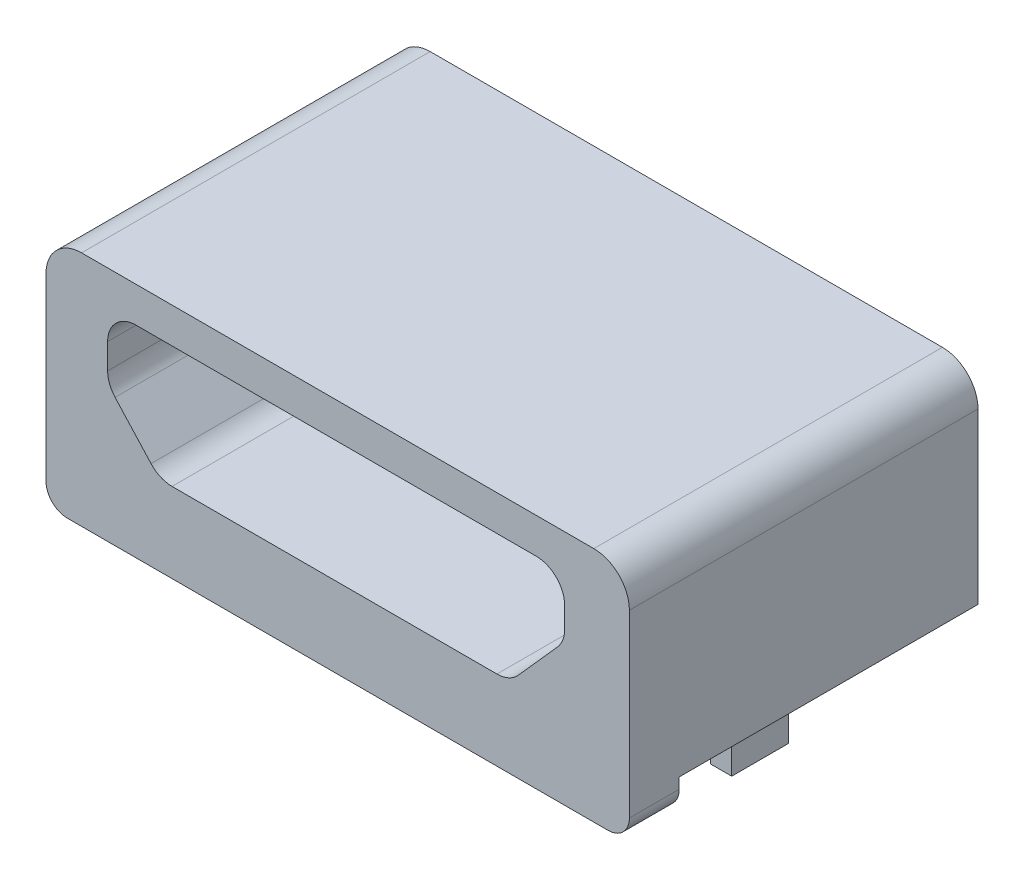
ISO-10303-21;
HEADER;
FILE_DESCRIPTION(('STEP AP214'),'2;1');
FILE_NAME('part.step','',(''),(''),'','','');
FILE_SCHEMA(('AUTOMOTIVE_DESIGN { 1 0 10303 214 1 1 1 1 }'));
ENDSEC;
DATA;
#1=APPLICATION_CONTEXT('core data for automotive mechanical design processes');
#2=APPLICATION_PROTOCOL_DEFINITION('international standard','automotive_design',2000,#1);
#3=PRODUCT_CONTEXT('',#1,'mechanical');
#4=PRODUCT('Part','Part','',(#3));
#5=PRODUCT_RELATED_PRODUCT_CATEGORY('part','',(#4));
#6=PRODUCT_DEFINITION_FORMATION('','',#4);
#7=PRODUCT_DEFINITION_CONTEXT('part definition',#1,'design');
#8=PRODUCT_DEFINITION('design','',#6,#7);
#9=PRODUCT_DEFINITION_SHAPE('','',#8);
#10=(LENGTH_UNIT() NAMED_UNIT(*) SI_UNIT(.MILLI.,.METRE.));
#11=(NAMED_UNIT(*) PLANE_ANGLE_UNIT() SI_UNIT($,.RADIAN.));
#12=(NAMED_UNIT(*) SI_UNIT($,.STERADIAN.) SOLID_ANGLE_UNIT());
#13=UNCERTAINTY_MEASURE_WITH_UNIT(LENGTH_MEASURE(1.E-05),#10,'distance_accuracy_value','');
#14=(GEOMETRIC_REPRESENTATION_CONTEXT(3) GLOBAL_UNCERTAINTY_ASSIGNED_CONTEXT((#13)) GLOBAL_UNIT_ASSIGNED_CONTEXT((#10,
#11,#12)) REPRESENTATION_CONTEXT('',''));
#15=CARTESIAN_POINT('',(0.,0.,0.));
#16=DIRECTION('',(0.,0.,1.));
#17=DIRECTION('',(1.,0.,0.));
#18=AXIS2_PLACEMENT_3D('',#15,#16,#17);
#19=CARTESIAN_POINT('',(0.,0.,4.2));
#20=DIRECTION('',(0.,1.,0.));
#21=DIRECTION('',(0.,0.,1.));
#22=AXIS2_PLACEMENT_3D('',#19,#20,#21);
#23=PLANE('',#22);
#24=DIRECTION('',(0.,0.,-1.));
#25=VECTOR('',#24,1.);
#26=CARTESIAN_POINT('',(0.34,0.,3.122));
#27=LINE('',#26,#25);
#28=CARTESIAN_POINT('',(0.34,0.,3.122));
#29=VERTEX_POINT('',#28);
#30=CARTESIAN_POINT('',(0.34,0.,2.322));
#31=VERTEX_POINT('',#30);
#32=EDGE_CURVE('E249',#29,#31,#27,.T.);
#33=ORIENTED_EDGE('',*,*,#32,.F.);
#34=DIRECTION('',(-1.,0.,0.));
#35=VECTOR('',#34,1.);
#36=CARTESIAN_POINT('',(0.34,0.,3.122));
#37=LINE('',#36,#35);
#38=CARTESIAN_POINT('',(0.64,0.,3.122));
#39=VERTEX_POINT('',#38);
#40=EDGE_CURVE('E262',#39,#29,#37,.T.);
#41=ORIENTED_EDGE('',*,*,#40,.F.);
#42=DIRECTION('',(0.,0.,1.));
#43=VECTOR('',#42,1.);
#44=CARTESIAN_POINT('',(0.64,0.,3.122));
#45=LINE('',#44,#43);
#46=CARTESIAN_POINT('',(0.64,0.,2.322));
#47=VERTEX_POINT('',#46);
#48=EDGE_CURVE('E271',#47,#39,#45,.T.);
#49=ORIENTED_EDGE('',*,*,#48,.F.);
#50=DIRECTION('',(1.,0.,0.));
#51=VECTOR('',#50,1.);
#52=CARTESIAN_POINT('',(0.34,0.,2.322));
#53=LINE('',#52,#51);
#54=EDGE_CURVE('E252',#31,#47,#53,.T.);
#55=ORIENTED_EDGE('',*,*,#54,.F.);
#56=EDGE_LOOP('',(#33,#41,#49,#55));
#57=FACE_BOUND('',#56,.T.);
#58=DIRECTION('',(1.,0.,0.));
#59=VECTOR('',#58,1.);
#60=CARTESIAN_POINT('',(0.,0.,0.));
#61=LINE('',#60,#59);
#62=CARTESIAN_POINT('',(0.,0.,0.));
#63=VERTEX_POINT('',#62);
#64=CARTESIAN_POINT('',(8.2,0.,0.));
#65=VERTEX_POINT('',#64);
#66=EDGE_CURVE('E489',#63,#65,#61,.T.);
#67=ORIENTED_EDGE('',*,*,#66,.T.);
#68=DIRECTION('',(0.,0.,-1.));
#69=VECTOR('',#68,1.);
#70=CARTESIAN_POINT('',(8.2,0.,4.2));
#71=LINE('',#70,#69);
#72=CARTESIAN_POINT('',(8.2,0.,4.2));
#73=VERTEX_POINT('',#72);
#74=EDGE_CURVE('E413',#73,#65,#71,.T.);
#75=ORIENTED_EDGE('',*,*,#74,.F.);
#76=DIRECTION('',(1.,0.,0.));
#77=VECTOR('',#76,1.);
#78=CARTESIAN_POINT('',(0.,0.,4.2));
#79=LINE('',#78,#77);
#80=CARTESIAN_POINT('',(0.,0.,4.2));
#81=VERTEX_POINT('',#80);
#82=EDGE_CURVE('E409',#81,#73,#79,.T.);
#83=ORIENTED_EDGE('',*,*,#82,.F.);
#84=DIRECTION('',(0.,0.,-1.));
#85=VECTOR('',#84,1.);
#86=CARTESIAN_POINT('',(0.,0.,4.2));
#87=LINE('',#86,#85);
#88=EDGE_CURVE('E417',#81,#63,#87,.T.);
#89=ORIENTED_EDGE('',*,*,#88,.T.);
#90=EDGE_LOOP('',(#67,#75,#83,#89));
#91=FACE_BOUND('',#90,.T.);
#92=DIRECTION('',(0.,0.,1.));
#93=VECTOR('',#92,1.);
#94=CARTESIAN_POINT('',(7.860000038,0.,2.322));
#95=LINE('',#94,#93);
#96=CARTESIAN_POINT('',(7.860000038,0.,2.322));
#97=VERTEX_POINT('',#96);
#98=CARTESIAN_POINT('',(7.860000038,0.,3.122));
#99=VERTEX_POINT('',#98);
#100=EDGE_CURVE('E248',#97,#99,#95,.T.);
#101=ORIENTED_EDGE('',*,*,#100,.F.);
#102=DIRECTION('',(1.,0.,0.));
#103=VECTOR('',#102,1.);
#104=CARTESIAN_POINT('',(7.860000038,0.,2.322));
#105=LINE('',#104,#103);
#106=CARTESIAN_POINT('',(7.560000038,0.,2.322));
#107=VERTEX_POINT('',#106);
#108=EDGE_CURVE('E245',#107,#97,#105,.T.);
#109=ORIENTED_EDGE('',*,*,#108,.F.);
#110=DIRECTION('',(0.,0.,-1.));
#111=VECTOR('',#110,1.);
#112=CARTESIAN_POINT('',(7.560000038,0.,2.322));
#113=LINE('',#112,#111);
#114=CARTESIAN_POINT('',(7.560000038,0.,3.122));
#115=VERTEX_POINT('',#114);
#116=EDGE_CURVE('E52',#115,#107,#113,.T.);
#117=ORIENTED_EDGE('',*,*,#116,.F.);
#118=DIRECTION('',(-1.,0.,0.));
#119=VECTOR('',#118,1.);
#120=CARTESIAN_POINT('',(7.860000038,0.,3.122));
#121=LINE('',#120,#119);
#122=EDGE_CURVE('E47',#99,#115,#121,.T.);
#123=ORIENTED_EDGE('',*,*,#122,.F.);
#124=EDGE_LOOP('',(#101,#109,#117,#123));
#125=FACE_BOUND('',#124,.T.);
#126=ADVANCED_FACE('F32',(#57,#91,#125),#23,.F.);
#127=CARTESIAN_POINT('',(0.,0.,4.2));
#128=DIRECTION('',(1.,0.,0.));
#129=DIRECTION('',(0.,0.,-1.));
#130=AXIS2_PLACEMENT_3D('',#127,#128,#129);
#131=PLANE('',#130);
#132=DIRECTION('',(0.,-1.,0.));
#133=VECTOR('',#132,1.);
#134=CARTESIAN_POINT('',(0.,2.88,4.2));
#135=LINE('',#134,#133);
#136=CARTESIAN_POINT('',(0.,-0.15,4.2));
#137=VERTEX_POINT('',#136);
#138=EDGE_CURVE('E361',#81,#137,#135,.T.);
#139=ORIENTED_EDGE('',*,*,#138,.T.);
#140=DIRECTION('',(0.,0.,-1.));
#141=VECTOR('',#140,1.);
#142=CARTESIAN_POINT('',(0.,-0.15,4.2));
#143=LINE('',#142,#141);
#144=CARTESIAN_POINT('',(0.,-0.15,4.9));
#145=VERTEX_POINT('',#144);
#146=EDGE_CURVE('E11',#137,#145,#143,.F.);
#147=ORIENTED_EDGE('',*,*,#146,.T.);
#148=DIRECTION('',(0.,-1.,0.));
#149=VECTOR('',#148,1.);
#150=CARTESIAN_POINT('',(0.,2.88,4.9));
#151=LINE('',#150,#149);
#152=CARTESIAN_POINT('',(0.,2.38,4.9));
#153=VERTEX_POINT('',#152);
#154=EDGE_CURVE('E384',#153,#145,#151,.T.);
#155=ORIENTED_EDGE('',*,*,#154,.F.);
#156=DIRECTION('',(0.,0.,-1.));
#157=VECTOR('',#156,1.);
#158=CARTESIAN_POINT('',(0.,2.38,4.2));
#159=LINE('',#158,#157);
#160=CARTESIAN_POINT('',(0.,2.38,0.));
#161=VERTEX_POINT('',#160);
#162=EDGE_CURVE('E438',#153,#161,#159,.T.);
#163=ORIENTED_EDGE('',*,*,#162,.T.);
#164=DIRECTION('',(0.,-1.,0.));
#165=VECTOR('',#164,1.);
#166=CARTESIAN_POINT('',(0.,0.,0.));
#167=LINE('',#166,#165);
#168=EDGE_CURVE('E396',#161,#63,#167,.T.);
#169=ORIENTED_EDGE('',*,*,#168,.T.);
#170=ORIENTED_EDGE('',*,*,#88,.F.);
#171=EDGE_LOOP('',(#139,#147,#155,#163,#169,#170));
#172=FACE_BOUND('',#171,.T.);
#173=ADVANCED_FACE('F483',(#172),#131,.F.);
#174=CARTESIAN_POINT('',(8.2,0.,4.2));
#175=DIRECTION('',(-1.,0.,0.));
#176=DIRECTION('',(0.,0.,1.));
#177=AXIS2_PLACEMENT_3D('',#174,#175,#176);
#178=PLANE('',#177);
#179=DIRECTION('',(0.,1.,0.));
#180=VECTOR('',#179,1.);
#181=CARTESIAN_POINT('',(8.2,2.88,4.9));
#182=LINE('',#181,#180);
#183=CARTESIAN_POINT('',(8.2,-0.15,4.9));
#184=VERTEX_POINT('',#183);
#185=CARTESIAN_POINT('',(8.2,2.38,4.9));
#186=VERTEX_POINT('',#185);
#187=EDGE_CURVE('E391',#184,#186,#182,.T.);
#188=ORIENTED_EDGE('',*,*,#187,.F.);
#189=DIRECTION('',(0.,0.,-1.));
#190=VECTOR('',#189,1.);
#191=CARTESIAN_POINT('',(8.2,-0.15,4.2));
#192=LINE('',#191,#190);
#193=CARTESIAN_POINT('',(8.2,-0.15,4.2));
#194=VERTEX_POINT('',#193);
#195=EDGE_CURVE('E441',#184,#194,#192,.T.);
#196=ORIENTED_EDGE('',*,*,#195,.T.);
#197=DIRECTION('',(0.,1.,0.));
#198=VECTOR('',#197,1.);
#199=CARTESIAN_POINT('',(8.2,2.88,4.2));
#200=LINE('',#199,#198);
#201=EDGE_CURVE('E388',#194,#73,#200,.T.);
#202=ORIENTED_EDGE('',*,*,#201,.T.);
#203=ORIENTED_EDGE('',*,*,#74,.T.);
#204=DIRECTION('',(0.,1.,0.));
#205=VECTOR('',#204,1.);
#206=CARTESIAN_POINT('',(8.2,0.,0.));
#207=LINE('',#206,#205);
#208=CARTESIAN_POINT('',(8.2,2.38,0.));
#209=VERTEX_POINT('',#208);
#210=EDGE_CURVE('E495',#65,#209,#207,.T.);
#211=ORIENTED_EDGE('',*,*,#210,.T.);
#212=DIRECTION('',(0.,0.,-1.));
#213=VECTOR('',#212,1.);
#214=CARTESIAN_POINT('',(8.2,2.38,4.2));
#215=LINE('',#214,#213);
#216=EDGE_CURVE('E431',#209,#186,#215,.F.);
#217=ORIENTED_EDGE('',*,*,#216,.T.);
#218=EDGE_LOOP('',(#188,#196,#202,#203,#211,#217));
#219=FACE_BOUND('',#218,.T.);
#220=ADVANCED_FACE('F464',(#219),#178,.F.);
#221=CARTESIAN_POINT('',(0.,2.88,4.2));
#222=DIRECTION('',(0.,-1.,0.));
#223=DIRECTION('',(1.,0.,0.));
#224=AXIS2_PLACEMENT_3D('',#221,#222,#223);
#225=PLANE('',#224);
#226=DIRECTION('',(-1.,0.,0.));
#227=VECTOR('',#226,1.);
#228=CARTESIAN_POINT('',(0.,2.88,4.9));
#229=LINE('',#228,#227);
#230=CARTESIAN_POINT('',(7.7,2.88,4.9));
#231=VERTEX_POINT('',#230);
#232=CARTESIAN_POINT('',(0.5,2.88,4.9));
#233=VERTEX_POINT('',#232);
#234=EDGE_CURVE('E393',#231,#233,#229,.T.);
#235=ORIENTED_EDGE('',*,*,#234,.F.);
#236=DIRECTION('',(0.,0.,-1.));
#237=VECTOR('',#236,1.);
#238=CARTESIAN_POINT('',(7.7,2.88,4.2));
#239=LINE('',#238,#237);
#240=CARTESIAN_POINT('',(7.7,2.88,0.));
#241=VERTEX_POINT('',#240);
#242=EDGE_CURVE('E424',#231,#241,#239,.T.);
#243=ORIENTED_EDGE('',*,*,#242,.T.);
#244=DIRECTION('',(-1.,0.,0.));
#245=VECTOR('',#244,1.);
#246=CARTESIAN_POINT('',(0.,2.88,0.));
#247=LINE('',#246,#245);
#248=CARTESIAN_POINT('',(0.5,2.88,0.));
#249=VERTEX_POINT('',#248);
#250=EDGE_CURVE('E414',#241,#249,#247,.T.);
#251=ORIENTED_EDGE('',*,*,#250,.T.);
#252=DIRECTION('',(0.,0.,-1.));
#253=VECTOR('',#252,1.);
#254=CARTESIAN_POINT('',(0.5,2.88,4.2));
#255=LINE('',#254,#253);
#256=EDGE_CURVE('E420',#249,#233,#255,.F.);
#257=ORIENTED_EDGE('',*,*,#256,.T.);
#258=EDGE_LOOP('',(#235,#243,#251,#257));
#259=FACE_BOUND('',#258,.T.);
#260=ADVANCED_FACE('F503',(#259),#225,.F.);
#261=CARTESIAN_POINT('',(0.,0.,0.));
#262=DIRECTION('',(0.,0.,-1.));
#263=DIRECTION('',(-1.,0.,0.));
#264=AXIS2_PLACEMENT_3D('',#261,#262,#263);
#265=PLANE('',#264);
#266=ORIENTED_EDGE('',*,*,#250,.F.);
#267=CARTESIAN_POINT('',(7.7,2.38,0.));
#268=DIRECTION('',(0.,0.,-1.));
#269=DIRECTION('',(-1.,0.,0.));
#270=AXIS2_PLACEMENT_3D('',#267,#268,#269);
#271=CIRCLE('',#270,0.5);
#272=EDGE_CURVE('E429',#241,#209,#271,.T.);
#273=ORIENTED_EDGE('',*,*,#272,.T.);
#274=ORIENTED_EDGE('',*,*,#210,.F.);
#275=ORIENTED_EDGE('',*,*,#66,.F.);
#276=ORIENTED_EDGE('',*,*,#168,.F.);
#277=CARTESIAN_POINT('',(0.5,2.38,0.));
#278=DIRECTION('',(0.,0.,-1.));
#279=DIRECTION('',(-1.,0.,0.));
#280=AXIS2_PLACEMENT_3D('',#277,#278,#279);
#281=CIRCLE('',#280,0.5);
#282=EDGE_CURVE('E427',#161,#249,#281,.T.);
#283=ORIENTED_EDGE('',*,*,#282,.T.);
#284=EDGE_LOOP('',(#266,#273,#274,#275,#276,#283));
#285=FACE_BOUND('',#284,.T.);
#286=ADVANCED_FACE('F509',(#285),#265,.T.);
#287=CARTESIAN_POINT('',(0.,0.,4.2));
#288=DIRECTION('',(0.,0.,1.));
#289=DIRECTION('',(1.,0.,0.));
#290=AXIS2_PLACEMENT_3D('',#287,#288,#289);
#291=PLANE('',#290);
#292=ORIENTED_EDGE('',*,*,#201,.F.);
#293=CARTESIAN_POINT('',(7.9,-0.15,4.2));
#294=DIRECTION('',(0.,0.,1.));
#295=DIRECTION('',(1.,0.,0.));
#296=AXIS2_PLACEMENT_3D('',#293,#294,#295);
#297=CIRCLE('',#296,0.3);
#298=CARTESIAN_POINT('',(7.9,-0.45,4.2));
#299=VERTEX_POINT('',#298);
#300=EDGE_CURVE('E447',#194,#299,#297,.F.);
#301=ORIENTED_EDGE('',*,*,#300,.T.);
#302=DIRECTION('',(1.,0.,0.));
#303=VECTOR('',#302,1.);
#304=CARTESIAN_POINT('',(0.,-0.45,4.2));
#305=LINE('',#304,#303);
#306=CARTESIAN_POINT('',(0.3,-0.45,4.2));
#307=VERTEX_POINT('',#306);
#308=EDGE_CURVE('E399',#307,#299,#305,.T.);
#309=ORIENTED_EDGE('',*,*,#308,.F.);
#310=CARTESIAN_POINT('',(0.3,-0.15,4.2));
#311=DIRECTION('',(0.,0.,1.));
#312=DIRECTION('',(1.,0.,0.));
#313=AXIS2_PLACEMENT_3D('',#310,#311,#312);
#314=CIRCLE('',#313,0.3);
#315=EDGE_CURVE('E445',#307,#137,#314,.F.);
#316=ORIENTED_EDGE('',*,*,#315,.T.);
#317=ORIENTED_EDGE('',*,*,#138,.F.);
#318=ORIENTED_EDGE('',*,*,#82,.T.);
#319=EDGE_LOOP('',(#292,#301,#309,#316,#317,#318));
#320=FACE_BOUND('',#319,.T.);
#321=ADVANCED_FACE('F473',(#320),#291,.F.);
#322=CARTESIAN_POINT('',(0.,-0.45,4.9));
#323=DIRECTION('',(0.,1.,0.));
#324=DIRECTION('',(-1.,0.,0.));
#325=AXIS2_PLACEMENT_3D('',#322,#323,#324);
#326=PLANE('',#325);
#327=ORIENTED_EDGE('',*,*,#308,.T.);
#328=DIRECTION('',(0.,0.,-1.));
#329=VECTOR('',#328,1.);
#330=CARTESIAN_POINT('',(7.9,-0.45,4.9));
#331=LINE('',#330,#329);
#332=CARTESIAN_POINT('',(7.9,-0.45,4.9));
#333=VERTEX_POINT('',#332);
#334=EDGE_CURVE('E452',#299,#333,#331,.F.);
#335=ORIENTED_EDGE('',*,*,#334,.T.);
#336=DIRECTION('',(1.,0.,0.));
#337=VECTOR('',#336,1.);
#338=CARTESIAN_POINT('',(0.,-0.45,4.9));
#339=LINE('',#338,#337);
#340=CARTESIAN_POINT('',(0.3,-0.45,4.9));
#341=VERTEX_POINT('',#340);
#342=EDGE_CURVE('E387',#341,#333,#339,.T.);
#343=ORIENTED_EDGE('',*,*,#342,.F.);
#344=DIRECTION('',(0.,0.,-1.));
#345=VECTOR('',#344,1.);
#346=CARTESIAN_POINT('',(0.3,-0.45,4.9));
#347=LINE('',#346,#345);
#348=EDGE_CURVE('E449',#341,#307,#347,.T.);
#349=ORIENTED_EDGE('',*,*,#348,.T.);
#350=EDGE_LOOP('',(#327,#335,#343,#349));
#351=FACE_BOUND('',#350,.T.);
#352=ADVANCED_FACE('F475',(#351),#326,.F.);
#353=CARTESIAN_POINT('',(0.,0.,4.9));
#354=DIRECTION('',(0.,0.,1.));
#355=DIRECTION('',(1.,0.,0.));
#356=AXIS2_PLACEMENT_3D('',#353,#354,#355);
#357=PLANE('',#356);
#358=CARTESIAN_POINT('',(6.33837051411964,1.07239500196352,4.9));
#359=DIRECTION('',(0.,0.,1.));
#360=DIRECTION('',(1.,0.,0.));
#361=AXIS2_PLACEMENT_3D('',#358,#359,#360);
#362=CIRCLE('',#361,0.4);
#363=CARTESIAN_POINT('',(6.33837051411964,0.672395001963518,4.9));
#364=VERTEX_POINT('',#363);
#365=CARTESIAN_POINT('',(6.63716932954903,0.806464056231367,4.9));
#366=VERTEX_POINT('',#365);
#367=EDGE_CURVE('E287',#364,#366,#362,.T.);
#368=ORIENTED_EDGE('',*,*,#367,.F.);
#369=DIRECTION('',(1.,0.,0.));
#370=VECTOR('',#369,1.);
#371=CARTESIAN_POINT('',(6.33837051411964,0.672395001963518,4.9));
#372=LINE('',#371,#370);
#373=CARTESIAN_POINT('',(1.77176703349473,0.672395001963518,4.9));
#374=VERTEX_POINT('',#373);
#375=EDGE_CURVE('E292',#374,#364,#372,.T.);
#376=ORIENTED_EDGE('',*,*,#375,.F.);
#377=CARTESIAN_POINT('',(1.77176703349473,1.07239500196352,4.9));
#378=DIRECTION('',(0.,0.,1.));
#379=DIRECTION('',(-1.,0.,0.));
#380=AXIS2_PLACEMENT_3D('',#377,#378,#379);
#381=CIRCLE('',#380,0.4);
#382=CARTESIAN_POINT('',(1.47637283592348,0.802687256354986,4.9));
#383=VERTEX_POINT('',#382);
#384=EDGE_CURVE('E354',#383,#374,#381,.T.);
#385=ORIENTED_EDGE('',*,*,#384,.F.);
#386=DIRECTION('',(0.674269364021332,-0.738485493928126,0.));
#387=VECTOR('',#386,1.);
#388=CARTESIAN_POINT('',(1.47637283592348,0.802687256354986,4.9));
#389=LINE('',#388,#387);
#390=CARTESIAN_POINT('',(0.970680014131213,1.35654129927033,4.9));
#391=VERTEX_POINT('',#390);
#392=EDGE_CURVE('E351',#391,#383,#389,.T.);
#393=ORIENTED_EDGE('',*,*,#392,.F.);
#394=CARTESIAN_POINT('',(1.26607421170246,1.62624904487886,4.9));
#395=DIRECTION('',(0.,0.,1.));
#396=DIRECTION('',(-1.,0.,0.));
#397=AXIS2_PLACEMENT_3D('',#394,#395,#396);
#398=CIRCLE('',#397,0.4);
#399=CARTESIAN_POINT('',(0.866074211702462,1.62624904487886,4.9));
#400=VERTEX_POINT('',#399);
#401=EDGE_CURVE('E348',#400,#391,#398,.T.);
#402=ORIENTED_EDGE('',*,*,#401,.F.);
#403=DIRECTION('',(0.,-1.,0.));
#404=VECTOR('',#403,1.);
#405=CARTESIAN_POINT('',(0.866074211702462,1.62624904487886,4.9));
#406=LINE('',#405,#404);
#407=CARTESIAN_POINT('',(0.866074211702462,1.98268595577456,4.9));
#408=VERTEX_POINT('',#407);
#409=EDGE_CURVE('E345',#408,#400,#406,.T.);
#410=ORIENTED_EDGE('',*,*,#409,.F.);
#411=CARTESIAN_POINT('',(1.26607421170246,1.98268595577456,4.9));
#412=DIRECTION('',(0.,0.,1.));
#413=DIRECTION('',(1.,0.,0.));
#414=AXIS2_PLACEMENT_3D('',#411,#412,#413);
#415=CIRCLE('',#414,0.4);
#416=CARTESIAN_POINT('',(1.26607421170247,2.38268595577456,4.9));
#417=VERTEX_POINT('',#416);
#418=EDGE_CURVE('E342',#417,#408,#415,.T.);
#419=ORIENTED_EDGE('',*,*,#418,.F.);
#420=DIRECTION('',(-1.,0.,0.));
#421=VECTOR('',#420,1.);
#422=CARTESIAN_POINT('',(1.26607421170247,2.38268595577456,4.9));
#423=LINE('',#422,#421);
#424=CARTESIAN_POINT('',(6.89051738845461,2.38268595577456,4.9));
#425=VERTEX_POINT('',#424);
#426=EDGE_CURVE('E339',#425,#417,#423,.T.);
#427=ORIENTED_EDGE('',*,*,#426,.F.);
#428=CARTESIAN_POINT('',(6.89051738845462,1.98268595577456,4.9));
#429=DIRECTION('',(0.,0.,1.));
#430=DIRECTION('',(1.,0.,0.));
#431=AXIS2_PLACEMENT_3D('',#428,#429,#430);
#432=CIRCLE('',#431,0.4);
#433=CARTESIAN_POINT('',(7.29051738845462,1.98268595577456,4.9));
#434=VERTEX_POINT('',#433);
#435=EDGE_CURVE('E336',#434,#425,#432,.T.);
#436=ORIENTED_EDGE('',*,*,#435,.F.);
#437=DIRECTION('',(0.,1.,0.));
#438=VECTOR('',#437,1.);
#439=CARTESIAN_POINT('',(7.29051738845462,1.98268595577456,4.9));
#440=LINE('',#439,#438);
#441=CARTESIAN_POINT('',(7.29051738845462,1.69278474840731,4.9));
#442=VERTEX_POINT('',#441);
#443=EDGE_CURVE('E333',#442,#434,#440,.T.);
#444=ORIENTED_EDGE('',*,*,#443,.F.);
#445=CARTESIAN_POINT('',(6.89051738845462,1.69278474840731,4.9));
#446=DIRECTION('',(0.,0.,1.));
#447=DIRECTION('',(1.,0.,0.));
#448=AXIS2_PLACEMENT_3D('',#445,#446,#447);
#449=CIRCLE('',#448,0.4);
#450=CARTESIAN_POINT('',(7.189316203884,1.42685380267516,4.9));
#451=VERTEX_POINT('',#450);
#452=EDGE_CURVE('E330',#451,#442,#449,.T.);
#453=ORIENTED_EDGE('',*,*,#452,.F.);
#454=DIRECTION('',(0.664827364330379,0.746997038573461,0.));
#455=VECTOR('',#454,1.);
#456=CARTESIAN_POINT('',(7.189316203884,1.42685380267516,4.9));
#457=LINE('',#456,#455);
#458=EDGE_CURVE('E327',#366,#451,#457,.T.);
#459=ORIENTED_EDGE('',*,*,#458,.F.);
#460=EDGE_LOOP('',(#368,#376,#385,#393,#402,#410,#419,#427,#436,#444,#453,#459));
#461=FACE_BOUND('',#460,.T.);
#462=ORIENTED_EDGE('',*,*,#342,.T.);
#463=CARTESIAN_POINT('',(7.9,-0.15,4.9));
#464=DIRECTION('',(0.,0.,1.));
#465=DIRECTION('',(1.,0.,0.));
#466=AXIS2_PLACEMENT_3D('',#463,#464,#465);
#467=CIRCLE('',#466,0.3);
#468=EDGE_CURVE('E40',#333,#184,#467,.T.);
#469=ORIENTED_EDGE('',*,*,#468,.T.);
#470=ORIENTED_EDGE('',*,*,#187,.T.);
#471=CARTESIAN_POINT('',(7.7,2.38,4.9));
#472=DIRECTION('',(0.,0.,1.));
#473=DIRECTION('',(1.,0.,0.));
#474=AXIS2_PLACEMENT_3D('',#471,#472,#473);
#475=CIRCLE('',#474,0.5);
#476=EDGE_CURVE('E436',#186,#231,#475,.T.);
#477=ORIENTED_EDGE('',*,*,#476,.T.);
#478=ORIENTED_EDGE('',*,*,#234,.T.);
#479=CARTESIAN_POINT('',(0.5,2.38,4.9));
#480=DIRECTION('',(0.,0.,1.));
#481=DIRECTION('',(1.,0.,0.));
#482=AXIS2_PLACEMENT_3D('',#479,#480,#481);
#483=CIRCLE('',#482,0.5);
#484=EDGE_CURVE('E434',#233,#153,#483,.T.);
#485=ORIENTED_EDGE('',*,*,#484,.T.);
#486=ORIENTED_EDGE('',*,*,#154,.T.);
#487=CARTESIAN_POINT('',(0.3,-0.15,4.9));
#488=DIRECTION('',(0.,0.,1.));
#489=DIRECTION('',(1.,0.,0.));
#490=AXIS2_PLACEMENT_3D('',#487,#488,#489);
#491=CIRCLE('',#490,0.3);
#492=EDGE_CURVE('E454',#145,#341,#491,.T.);
#493=ORIENTED_EDGE('',*,*,#492,.T.);
#494=EDGE_LOOP('',(#462,#469,#470,#477,#478,#485,#486,#493));
#495=FACE_BOUND('',#494,.T.);
#496=ADVANCED_FACE('F458',(#461,#495),#357,.T.);
#497=CARTESIAN_POINT('',(7.7,2.38,4.2));
#498=DIRECTION('',(0.,0.,-1.));
#499=DIRECTION('',(-1.,0.,0.));
#500=AXIS2_PLACEMENT_3D('',#497,#498,#499);
#501=CYLINDRICAL_SURFACE('',#500,0.5);
#502=ORIENTED_EDGE('',*,*,#476,.F.);
#503=ORIENTED_EDGE('',*,*,#216,.F.);
#504=ORIENTED_EDGE('',*,*,#272,.F.);
#505=ORIENTED_EDGE('',*,*,#242,.F.);
#506=EDGE_LOOP('',(#502,#503,#504,#505));
#507=FACE_BOUND('',#506,.T.);
#508=ADVANCED_FACE('F498',(#507),#501,.T.);
#509=CARTESIAN_POINT('',(0.5,2.38,4.2));
#510=DIRECTION('',(0.,0.,-1.));
#511=DIRECTION('',(-1.,0.,0.));
#512=AXIS2_PLACEMENT_3D('',#509,#510,#511);
#513=CYLINDRICAL_SURFACE('',#512,0.5);
#514=ORIENTED_EDGE('',*,*,#484,.F.);
#515=ORIENTED_EDGE('',*,*,#256,.F.);
#516=ORIENTED_EDGE('',*,*,#282,.F.);
#517=ORIENTED_EDGE('',*,*,#162,.F.);
#518=EDGE_LOOP('',(#514,#515,#516,#517));
#519=FACE_BOUND('',#518,.T.);
#520=ADVANCED_FACE('F507',(#519),#513,.T.);
#521=CARTESIAN_POINT('',(7.9,-0.15,4.2));
#522=DIRECTION('',(0.,0.,-1.));
#523=DIRECTION('',(-1.,0.,0.));
#524=AXIS2_PLACEMENT_3D('',#521,#522,#523);
#525=CYLINDRICAL_SURFACE('',#524,0.3);
#526=ORIENTED_EDGE('',*,*,#468,.F.);
#527=ORIENTED_EDGE('',*,*,#334,.F.);
#528=ORIENTED_EDGE('',*,*,#300,.F.);
#529=ORIENTED_EDGE('',*,*,#195,.F.);
#530=EDGE_LOOP('',(#526,#527,#528,#529));
#531=FACE_BOUND('',#530,.T.);
#532=ADVANCED_FACE('F469',(#531),#525,.T.);
#533=CARTESIAN_POINT('',(0.3,-0.15,4.9));
#534=DIRECTION('',(0.,0.,-1.));
#535=DIRECTION('',(-1.,0.,0.));
#536=AXIS2_PLACEMENT_3D('',#533,#534,#535);
#537=CYLINDRICAL_SURFACE('',#536,0.3);
#538=ORIENTED_EDGE('',*,*,#492,.F.);
#539=ORIENTED_EDGE('',*,*,#146,.F.);
#540=ORIENTED_EDGE('',*,*,#315,.F.);
#541=ORIENTED_EDGE('',*,*,#348,.F.);
#542=EDGE_LOOP('',(#538,#539,#540,#541));
#543=FACE_BOUND('',#542,.T.);
#544=ADVANCED_FACE('F34',(#543),#537,.T.);
#545=CARTESIAN_POINT('',(6.33837051411964,1.07239500196352,1.9));
#546=DIRECTION('',(0.,0.,1.));
#547=DIRECTION('',(1.,0.,0.));
#548=AXIS2_PLACEMENT_3D('',#545,#546,#547);
#549=CYLINDRICAL_SURFACE('',#548,0.4);
#550=ORIENTED_EDGE('',*,*,#367,.T.);
#551=DIRECTION('',(0.,0.,1.));
#552=VECTOR('',#551,1.);
#553=CARTESIAN_POINT('',(6.63716932954903,0.806464056231367,1.9));
#554=LINE('',#553,#552);
#555=CARTESIAN_POINT('',(6.63716932954903,0.806464056231367,1.9));
#556=VERTEX_POINT('',#555);
#557=EDGE_CURVE('E325',#556,#366,#554,.T.);
#558=ORIENTED_EDGE('',*,*,#557,.F.);
#559=CARTESIAN_POINT('',(6.33837051411964,1.07239500196352,1.9));
#560=DIRECTION('',(0.,0.,1.));
#561=DIRECTION('',(1.,0.,0.));
#562=AXIS2_PLACEMENT_3D('',#559,#560,#561);
#563=CIRCLE('',#562,0.4);
#564=CARTESIAN_POINT('',(6.33837051411964,0.672395001963518,1.9));
#565=VERTEX_POINT('',#564);
#566=EDGE_CURVE('E288',#565,#556,#563,.T.);
#567=ORIENTED_EDGE('',*,*,#566,.F.);
#568=DIRECTION('',(0.,0.,1.));
#569=VECTOR('',#568,1.);
#570=CARTESIAN_POINT('',(6.33837051411964,0.672395001963518,1.9));
#571=LINE('',#570,#569);
#572=EDGE_CURVE('E359',#565,#364,#571,.T.);
#573=ORIENTED_EDGE('',*,*,#572,.T.);
#574=EDGE_LOOP('',(#550,#558,#567,#573));
#575=FACE_BOUND('',#574,.T.);
#576=ADVANCED_FACE('F535',(#575),#549,.F.);
#577=CARTESIAN_POINT('',(6.33837051411964,0.672395001963518,1.9));
#578=DIRECTION('',(0.,-1.,0.));
#579=DIRECTION('',(0.,0.,-1.));
#580=AXIS2_PLACEMENT_3D('',#577,#578,#579);
#581=PLANE('',#580);
#582=ORIENTED_EDGE('',*,*,#375,.T.);
#583=ORIENTED_EDGE('',*,*,#572,.F.);
#584=DIRECTION('',(1.,0.,0.));
#585=VECTOR('',#584,1.);
#586=CARTESIAN_POINT('',(6.33837051411964,0.672395001963518,1.9));
#587=LINE('',#586,#585);
#588=CARTESIAN_POINT('',(1.77176703349473,0.672395001963518,1.9));
#589=VERTEX_POINT('',#588);
#590=EDGE_CURVE('E322',#589,#565,#587,.T.);
#591=ORIENTED_EDGE('',*,*,#590,.F.);
#592=DIRECTION('',(0.,0.,1.));
#593=VECTOR('',#592,1.);
#594=CARTESIAN_POINT('',(1.77176703349473,0.672395001963518,1.9));
#595=LINE('',#594,#593);
#596=EDGE_CURVE('E362',#589,#374,#595,.T.);
#597=ORIENTED_EDGE('',*,*,#596,.T.);
#598=EDGE_LOOP('',(#582,#583,#591,#597));
#599=FACE_BOUND('',#598,.T.);
#600=ADVANCED_FACE('F539',(#599),#581,.F.);
#601=CARTESIAN_POINT('',(1.77176703349473,1.07239500196352,1.9));
#602=DIRECTION('',(0.,0.,1.));
#603=DIRECTION('',(1.,0.,0.));
#604=AXIS2_PLACEMENT_3D('',#601,#602,#603);
#605=CYLINDRICAL_SURFACE('',#604,0.4);
#606=ORIENTED_EDGE('',*,*,#384,.T.);
#607=ORIENTED_EDGE('',*,*,#596,.F.);
#608=CARTESIAN_POINT('',(1.77176703349473,1.07239500196352,1.9));
#609=DIRECTION('',(0.,0.,1.));
#610=DIRECTION('',(-1.,0.,0.));
#611=AXIS2_PLACEMENT_3D('',#608,#609,#610);
#612=CIRCLE('',#611,0.4);
#613=CARTESIAN_POINT('',(1.47637283592348,0.802687256354986,1.9));
#614=VERTEX_POINT('',#613);
#615=EDGE_CURVE('E319',#614,#589,#612,.T.);
#616=ORIENTED_EDGE('',*,*,#615,.F.);
#617=DIRECTION('',(0.,0.,1.));
#618=VECTOR('',#617,1.);
#619=CARTESIAN_POINT('',(1.47637283592348,0.802687256354986,1.9));
#620=LINE('',#619,#618);
#621=EDGE_CURVE('E364',#614,#383,#620,.T.);
#622=ORIENTED_EDGE('',*,*,#621,.T.);
#623=EDGE_LOOP('',(#606,#607,#616,#622));
#624=FACE_BOUND('',#623,.T.);
#625=ADVANCED_FACE('F545',(#624),#605,.F.);
#626=CARTESIAN_POINT('',(1.47637283592348,0.802687256354986,1.9));
#627=DIRECTION('',(-0.738485493928126,-0.674269364021332,0.));
#628=DIRECTION('',(0.674269364021332,-0.738485493928126,0.));
#629=AXIS2_PLACEMENT_3D('',#626,#627,#628);
#630=PLANE('',#629);
#631=ORIENTED_EDGE('',*,*,#392,.T.);
#632=ORIENTED_EDGE('',*,*,#621,.F.);
#633=DIRECTION('',(0.674269364021332,-0.738485493928126,0.));
#634=VECTOR('',#633,1.);
#635=CARTESIAN_POINT('',(1.47637283592348,0.802687256354986,1.9));
#636=LINE('',#635,#634);
#637=CARTESIAN_POINT('',(0.970680014131213,1.35654129927033,1.9));
#638=VERTEX_POINT('',#637);
#639=EDGE_CURVE('E316',#638,#614,#636,.T.);
#640=ORIENTED_EDGE('',*,*,#639,.F.);
#641=DIRECTION('',(0.,0.,1.));
#642=VECTOR('',#641,1.);
#643=CARTESIAN_POINT('',(0.970680014131213,1.35654129927033,1.9));
#644=LINE('',#643,#642);
#645=EDGE_CURVE('E366',#638,#391,#644,.T.);
#646=ORIENTED_EDGE('',*,*,#645,.T.);
#647=EDGE_LOOP('',(#631,#632,#640,#646));
#648=FACE_BOUND('',#647,.T.);
#649=ADVANCED_FACE('F640',(#648),#630,.F.);
#650=CARTESIAN_POINT('',(1.26607421170246,1.62624904487886,1.9));
#651=DIRECTION('',(0.,0.,1.));
#652=DIRECTION('',(1.,0.,0.));
#653=AXIS2_PLACEMENT_3D('',#650,#651,#652);
#654=CYLINDRICAL_SURFACE('',#653,0.4);
#655=ORIENTED_EDGE('',*,*,#401,.T.);
#656=ORIENTED_EDGE('',*,*,#645,.F.);
#657=CARTESIAN_POINT('',(1.26607421170246,1.62624904487886,1.9));
#658=DIRECTION('',(0.,0.,1.));
#659=DIRECTION('',(-1.,0.,0.));
#660=AXIS2_PLACEMENT_3D('',#657,#658,#659);
#661=CIRCLE('',#660,0.4);
#662=CARTESIAN_POINT('',(0.866074211702462,1.62624904487886,1.9));
#663=VERTEX_POINT('',#662);
#664=EDGE_CURVE('E313',#663,#638,#661,.T.);
#665=ORIENTED_EDGE('',*,*,#664,.F.);
#666=DIRECTION('',(0.,0.,1.));
#667=VECTOR('',#666,1.);
#668=CARTESIAN_POINT('',(0.866074211702462,1.62624904487886,1.9));
#669=LINE('',#668,#667);
#670=EDGE_CURVE('E368',#663,#400,#669,.T.);
#671=ORIENTED_EDGE('',*,*,#670,.T.);
#672=EDGE_LOOP('',(#655,#656,#665,#671));
#673=FACE_BOUND('',#672,.T.);
#674=ADVANCED_FACE('F649',(#673),#654,.F.);
#675=CARTESIAN_POINT('',(0.866074211702462,1.62624904487886,1.9));
#676=DIRECTION('',(-1.,0.,0.));
#677=DIRECTION('',(0.,0.,1.));
#678=AXIS2_PLACEMENT_3D('',#675,#676,#677);
#679=PLANE('',#678);
#680=ORIENTED_EDGE('',*,*,#409,.T.);
#681=ORIENTED_EDGE('',*,*,#670,.F.);
#682=DIRECTION('',(0.,-1.,0.));
#683=VECTOR('',#682,1.);
#684=CARTESIAN_POINT('',(0.866074211702462,1.62624904487886,1.9));
#685=LINE('',#684,#683);
#686=CARTESIAN_POINT('',(0.866074211702462,1.98268595577456,1.9));
#687=VERTEX_POINT('',#686);
#688=EDGE_CURVE('E310',#687,#663,#685,.T.);
#689=ORIENTED_EDGE('',*,*,#688,.F.);
#690=DIRECTION('',(0.,0.,1.));
#691=VECTOR('',#690,1.);
#692=CARTESIAN_POINT('',(0.866074211702462,1.98268595577456,1.9));
#693=LINE('',#692,#691);
#694=EDGE_CURVE('E370',#687,#408,#693,.T.);
#695=ORIENTED_EDGE('',*,*,#694,.T.);
#696=EDGE_LOOP('',(#680,#681,#689,#695));
#697=FACE_BOUND('',#696,.T.);
#698=ADVANCED_FACE('F658',(#697),#679,.F.);
#699=CARTESIAN_POINT('',(1.26607421170246,1.98268595577456,1.9));
#700=DIRECTION('',(0.,0.,1.));
#701=DIRECTION('',(1.,0.,0.));
#702=AXIS2_PLACEMENT_3D('',#699,#700,#701);
#703=CYLINDRICAL_SURFACE('',#702,0.4);
#704=ORIENTED_EDGE('',*,*,#418,.T.);
#705=ORIENTED_EDGE('',*,*,#694,.F.);
#706=CARTESIAN_POINT('',(1.26607421170246,1.98268595577456,1.9));
#707=DIRECTION('',(0.,0.,1.));
#708=DIRECTION('',(1.,0.,0.));
#709=AXIS2_PLACEMENT_3D('',#706,#707,#708);
#710=CIRCLE('',#709,0.4);
#711=CARTESIAN_POINT('',(1.26607421170247,2.38268595577456,1.9));
#712=VERTEX_POINT('',#711);
#713=EDGE_CURVE('E307',#712,#687,#710,.T.);
#714=ORIENTED_EDGE('',*,*,#713,.F.);
#715=DIRECTION('',(0.,0.,1.));
#716=VECTOR('',#715,1.);
#717=CARTESIAN_POINT('',(1.26607421170247,2.38268595577456,1.9));
#718=LINE('',#717,#716);
#719=EDGE_CURVE('E372',#712,#417,#718,.T.);
#720=ORIENTED_EDGE('',*,*,#719,.T.);
#721=EDGE_LOOP('',(#704,#705,#714,#720));
#722=FACE_BOUND('',#721,.T.);
#723=ADVANCED_FACE('F667',(#722),#703,.F.);
#724=CARTESIAN_POINT('',(1.26607421170247,2.38268595577456,1.9));
#725=DIRECTION('',(0.,1.,0.));
#726=DIRECTION('',(0.,0.,1.));
#727=AXIS2_PLACEMENT_3D('',#724,#725,#726);
#728=PLANE('',#727);
#729=ORIENTED_EDGE('',*,*,#426,.T.);
#730=ORIENTED_EDGE('',*,*,#719,.F.);
#731=DIRECTION('',(-1.,0.,0.));
#732=VECTOR('',#731,1.);
#733=CARTESIAN_POINT('',(1.26607421170247,2.38268595577456,1.9));
#734=LINE('',#733,#732);
#735=CARTESIAN_POINT('',(6.89051738845461,2.38268595577456,1.9));
#736=VERTEX_POINT('',#735);
#737=EDGE_CURVE('E304',#736,#712,#734,.T.);
#738=ORIENTED_EDGE('',*,*,#737,.F.);
#739=DIRECTION('',(0.,0.,1.));
#740=VECTOR('',#739,1.);
#741=CARTESIAN_POINT('',(6.89051738845461,2.38268595577456,1.9));
#742=LINE('',#741,#740);
#743=EDGE_CURVE('E374',#736,#425,#742,.T.);
#744=ORIENTED_EDGE('',*,*,#743,.T.);
#745=EDGE_LOOP('',(#729,#730,#738,#744));
#746=FACE_BOUND('',#745,.T.);
#747=ADVANCED_FACE('F676',(#746),#728,.F.);
#748=CARTESIAN_POINT('',(6.89051738845462,1.98268595577456,1.9));
#749=DIRECTION('',(0.,0.,1.));
#750=DIRECTION('',(1.,0.,0.));
#751=AXIS2_PLACEMENT_3D('',#748,#749,#750);
#752=CYLINDRICAL_SURFACE('',#751,0.4);
#753=ORIENTED_EDGE('',*,*,#435,.T.);
#754=ORIENTED_EDGE('',*,*,#743,.F.);
#755=CARTESIAN_POINT('',(6.89051738845462,1.98268595577456,1.9));
#756=DIRECTION('',(0.,0.,1.));
#757=DIRECTION('',(1.,0.,0.));
#758=AXIS2_PLACEMENT_3D('',#755,#756,#757);
#759=CIRCLE('',#758,0.4);
#760=CARTESIAN_POINT('',(7.29051738845462,1.98268595577456,1.9));
#761=VERTEX_POINT('',#760);
#762=EDGE_CURVE('E301',#761,#736,#759,.T.);
#763=ORIENTED_EDGE('',*,*,#762,.F.);
#764=DIRECTION('',(0.,0.,1.));
#765=VECTOR('',#764,1.);
#766=CARTESIAN_POINT('',(7.29051738845462,1.98268595577456,1.9));
#767=LINE('',#766,#765);
#768=EDGE_CURVE('E376',#761,#434,#767,.T.);
#769=ORIENTED_EDGE('',*,*,#768,.T.);
#770=EDGE_LOOP('',(#753,#754,#763,#769));
#771=FACE_BOUND('',#770,.T.);
#772=ADVANCED_FACE('F685',(#771),#752,.F.);
#773=CARTESIAN_POINT('',(7.29051738845462,1.98268595577456,1.9));
#774=DIRECTION('',(1.,0.,0.));
#775=DIRECTION('',(0.,0.,-1.));
#776=AXIS2_PLACEMENT_3D('',#773,#774,#775);
#777=PLANE('',#776);
#778=ORIENTED_EDGE('',*,*,#443,.T.);
#779=ORIENTED_EDGE('',*,*,#768,.F.);
#780=DIRECTION('',(0.,1.,0.));
#781=VECTOR('',#780,1.);
#782=CARTESIAN_POINT('',(7.29051738845462,1.98268595577456,1.9));
#783=LINE('',#782,#781);
#784=CARTESIAN_POINT('',(7.29051738845462,1.69278474840731,1.9));
#785=VERTEX_POINT('',#784);
#786=EDGE_CURVE('E298',#785,#761,#783,.T.);
#787=ORIENTED_EDGE('',*,*,#786,.F.);
#788=DIRECTION('',(0.,0.,1.));
#789=VECTOR('',#788,1.);
#790=CARTESIAN_POINT('',(7.29051738845462,1.69278474840731,1.9));
#791=LINE('',#790,#789);
#792=EDGE_CURVE('E378',#785,#442,#791,.T.);
#793=ORIENTED_EDGE('',*,*,#792,.T.);
#794=EDGE_LOOP('',(#778,#779,#787,#793));
#795=FACE_BOUND('',#794,.T.);
#796=ADVANCED_FACE('F694',(#795),#777,.F.);
#797=CARTESIAN_POINT('',(6.89051738845462,1.69278474840731,1.9));
#798=DIRECTION('',(0.,0.,1.));
#799=DIRECTION('',(1.,0.,0.));
#800=AXIS2_PLACEMENT_3D('',#797,#798,#799);
#801=CYLINDRICAL_SURFACE('',#800,0.4);
#802=ORIENTED_EDGE('',*,*,#452,.T.);
#803=ORIENTED_EDGE('',*,*,#792,.F.);
#804=CARTESIAN_POINT('',(6.89051738845462,1.69278474840731,1.9));
#805=DIRECTION('',(0.,0.,1.));
#806=DIRECTION('',(1.,0.,0.));
#807=AXIS2_PLACEMENT_3D('',#804,#805,#806);
#808=CIRCLE('',#807,0.4);
#809=CARTESIAN_POINT('',(7.189316203884,1.42685380267516,1.9));
#810=VERTEX_POINT('',#809);
#811=EDGE_CURVE('E295',#810,#785,#808,.T.);
#812=ORIENTED_EDGE('',*,*,#811,.F.);
#813=DIRECTION('',(0.,0.,1.));
#814=VECTOR('',#813,1.);
#815=CARTESIAN_POINT('',(7.189316203884,1.42685380267516,1.9));
#816=LINE('',#815,#814);
#817=EDGE_CURVE('E380',#810,#451,#816,.T.);
#818=ORIENTED_EDGE('',*,*,#817,.T.);
#819=EDGE_LOOP('',(#802,#803,#812,#818));
#820=FACE_BOUND('',#819,.T.);
#821=ADVANCED_FACE('F703',(#820),#801,.F.);
#822=CARTESIAN_POINT('',(7.189316203884,1.42685380267516,1.9));
#823=DIRECTION('',(0.746997038573461,-0.664827364330379,0.));
#824=DIRECTION('',(0.664827364330379,0.746997038573461,0.));
#825=AXIS2_PLACEMENT_3D('',#822,#823,#824);
#826=PLANE('',#825);
#827=ORIENTED_EDGE('',*,*,#458,.T.);
#828=ORIENTED_EDGE('',*,*,#817,.F.);
#829=DIRECTION('',(0.664827364330379,0.746997038573461,0.));
#830=VECTOR('',#829,1.);
#831=CARTESIAN_POINT('',(7.189316203884,1.42685380267516,1.9));
#832=LINE('',#831,#830);
#833=EDGE_CURVE('E291',#556,#810,#832,.T.);
#834=ORIENTED_EDGE('',*,*,#833,.F.);
#835=ORIENTED_EDGE('',*,*,#557,.T.);
#836=EDGE_LOOP('',(#827,#828,#834,#835));
#837=FACE_BOUND('',#836,.T.);
#838=ADVANCED_FACE('F550',(#837),#826,.F.);
#839=CARTESIAN_POINT('',(6.33837051411964,1.07239500196352,1.9));
#840=DIRECTION('',(0.,0.,1.));
#841=DIRECTION('',(1.,0.,0.));
#842=AXIS2_PLACEMENT_3D('',#839,#840,#841);
#843=PLANE('',#842);
#844=ORIENTED_EDGE('',*,*,#566,.T.);
#845=ORIENTED_EDGE('',*,*,#833,.T.);
#846=ORIENTED_EDGE('',*,*,#811,.T.);
#847=ORIENTED_EDGE('',*,*,#786,.T.);
#848=ORIENTED_EDGE('',*,*,#762,.T.);
#849=ORIENTED_EDGE('',*,*,#737,.T.);
#850=ORIENTED_EDGE('',*,*,#713,.T.);
#851=ORIENTED_EDGE('',*,*,#688,.T.);
#852=ORIENTED_EDGE('',*,*,#664,.T.);
#853=ORIENTED_EDGE('',*,*,#639,.T.);
#854=ORIENTED_EDGE('',*,*,#615,.T.);
#855=ORIENTED_EDGE('',*,*,#590,.T.);
#856=EDGE_LOOP('',(#844,#845,#846,#847,#848,#849,#850,#851,#852,#853,#854,#855));
#857=FACE_BOUND('',#856,.T.);
#858=ADVANCED_FACE('F719',(#857),#843,.T.);
#859=CARTESIAN_POINT('',(0.34,-0.7,3.122));
#860=DIRECTION('',(1.,0.,0.));
#861=DIRECTION('',(0.,0.,-1.));
#862=AXIS2_PLACEMENT_3D('',#859,#860,#861);
#863=PLANE('',#862);
#864=ORIENTED_EDGE('',*,*,#32,.T.);
#865=DIRECTION('',(0.,1.,0.));
#866=VECTOR('',#865,1.);
#867=CARTESIAN_POINT('',(0.34,-0.7,2.322));
#868=LINE('',#867,#866);
#869=CARTESIAN_POINT('',(0.34,-0.7,2.322));
#870=VERTEX_POINT('',#869);
#871=EDGE_CURVE('E284',#870,#31,#868,.T.);
#872=ORIENTED_EDGE('',*,*,#871,.F.);
#873=DIRECTION('',(0.,0.,-1.));
#874=VECTOR('',#873,1.);
#875=CARTESIAN_POINT('',(0.34,-0.7,3.122));
#876=LINE('',#875,#874);
#877=CARTESIAN_POINT('',(0.34,-0.7,3.122));
#878=VERTEX_POINT('',#877);
#879=EDGE_CURVE('E258',#878,#870,#876,.T.);
#880=ORIENTED_EDGE('',*,*,#879,.F.);
#881=DIRECTION('',(0.,1.,0.));
#882=VECTOR('',#881,1.);
#883=CARTESIAN_POINT('',(0.34,-0.7,3.122));
#884=LINE('',#883,#882);
#885=EDGE_CURVE('E267',#878,#29,#884,.T.);
#886=ORIENTED_EDGE('',*,*,#885,.T.);
#887=EDGE_LOOP('',(#864,#872,#880,#886));
#888=FACE_BOUND('',#887,.T.);
#889=ADVANCED_FACE('F727',(#888),#863,.F.);
#890=CARTESIAN_POINT('',(0.34,-0.7,2.322));
#891=DIRECTION('',(0.,0.,1.));
#892=DIRECTION('',(1.,0.,0.));
#893=AXIS2_PLACEMENT_3D('',#890,#891,#892);
#894=PLANE('',#893);
#895=ORIENTED_EDGE('',*,*,#54,.T.);
#896=DIRECTION('',(0.,1.,0.));
#897=VECTOR('',#896,1.);
#898=CARTESIAN_POINT('',(0.64,-0.7,2.322));
#899=LINE('',#898,#897);
#900=CARTESIAN_POINT('',(0.64,-0.7,2.322));
#901=VERTEX_POINT('',#900);
#902=EDGE_CURVE('E281',#901,#47,#899,.T.);
#903=ORIENTED_EDGE('',*,*,#902,.F.);
#904=DIRECTION('',(1.,0.,0.));
#905=VECTOR('',#904,1.);
#906=CARTESIAN_POINT('',(0.34,-0.7,2.322));
#907=LINE('',#906,#905);
#908=EDGE_CURVE('E261',#870,#901,#907,.T.);
#909=ORIENTED_EDGE('',*,*,#908,.F.);
#910=ORIENTED_EDGE('',*,*,#871,.T.);
#911=EDGE_LOOP('',(#895,#903,#909,#910));
#912=FACE_BOUND('',#911,.T.);
#913=ADVANCED_FACE('F740',(#912),#894,.F.);
#914=CARTESIAN_POINT('',(0.64,-0.7,3.122));
#915=DIRECTION('',(-1.,0.,0.));
#916=DIRECTION('',(0.,0.,1.));
#917=AXIS2_PLACEMENT_3D('',#914,#915,#916);
#918=PLANE('',#917);
#919=ORIENTED_EDGE('',*,*,#48,.T.);
#920=DIRECTION('',(0.,1.,0.));
#921=VECTOR('',#920,1.);
#922=CARTESIAN_POINT('',(0.64,-0.7,3.122));
#923=LINE('',#922,#921);
#924=CARTESIAN_POINT('',(0.64,-0.7,3.122));
#925=VERTEX_POINT('',#924);
#926=EDGE_CURVE('E278',#925,#39,#923,.T.);
#927=ORIENTED_EDGE('',*,*,#926,.F.);
#928=DIRECTION('',(0.,0.,1.));
#929=VECTOR('',#928,1.);
#930=CARTESIAN_POINT('',(0.64,-0.7,3.122));
#931=LINE('',#930,#929);
#932=EDGE_CURVE('E264',#901,#925,#931,.T.);
#933=ORIENTED_EDGE('',*,*,#932,.F.);
#934=ORIENTED_EDGE('',*,*,#902,.T.);
#935=EDGE_LOOP('',(#919,#927,#933,#934));
#936=FACE_BOUND('',#935,.T.);
#937=ADVANCED_FACE('F749',(#936),#918,.F.);
#938=CARTESIAN_POINT('',(0.34,-0.7,3.122));
#939=DIRECTION('',(0.,0.,-1.));
#940=DIRECTION('',(-1.,0.,0.));
#941=AXIS2_PLACEMENT_3D('',#938,#939,#940);
#942=PLANE('',#941);
#943=ORIENTED_EDGE('',*,*,#40,.T.);
#944=ORIENTED_EDGE('',*,*,#885,.F.);
#945=DIRECTION('',(-1.,0.,0.));
#946=VECTOR('',#945,1.);
#947=CARTESIAN_POINT('',(0.34,-0.7,3.122));
#948=LINE('',#947,#946);
#949=EDGE_CURVE('E266',#925,#878,#948,.T.);
#950=ORIENTED_EDGE('',*,*,#949,.F.);
#951=ORIENTED_EDGE('',*,*,#926,.T.);
#952=EDGE_LOOP('',(#943,#944,#950,#951));
#953=FACE_BOUND('',#952,.T.);
#954=ADVANCED_FACE('F758',(#953),#942,.F.);
#955=CARTESIAN_POINT('',(0.,-0.7,0.));
#956=DIRECTION('',(0.,-1.,0.));
#957=DIRECTION('',(0.,0.,-1.));
#958=AXIS2_PLACEMENT_3D('',#955,#956,#957);
#959=PLANE('',#958);
#960=ORIENTED_EDGE('',*,*,#879,.T.);
#961=ORIENTED_EDGE('',*,*,#908,.T.);
#962=ORIENTED_EDGE('',*,*,#932,.T.);
#963=ORIENTED_EDGE('',*,*,#949,.T.);
#964=EDGE_LOOP('',(#960,#961,#962,#963));
#965=FACE_BOUND('',#964,.T.);
#966=ADVANCED_FACE('F767',(#965),#959,.T.);
#967=CARTESIAN_POINT('',(7.860000038,-0.7,2.322));
#968=DIRECTION('',(-1.,0.,0.));
#969=DIRECTION('',(0.,0.,1.));
#970=AXIS2_PLACEMENT_3D('',#967,#968,#969);
#971=PLANE('',#970);
#972=ORIENTED_EDGE('',*,*,#100,.T.);
#973=DIRECTION('',(0.,1.,0.));
#974=VECTOR('',#973,1.);
#975=CARTESIAN_POINT('',(7.860000038,-0.7,3.122));
#976=LINE('',#975,#974);
#977=CARTESIAN_POINT('',(7.860000038,-0.7,3.122));
#978=VERTEX_POINT('',#977);
#979=EDGE_CURVE('E229',#978,#99,#976,.T.);
#980=ORIENTED_EDGE('',*,*,#979,.F.);
#981=DIRECTION('',(0.,0.,1.));
#982=VECTOR('',#981,1.);
#983=CARTESIAN_POINT('',(7.860000038,-0.7,2.322));
#984=LINE('',#983,#982);
#985=CARTESIAN_POINT('',(7.860000038,-0.7,2.322));
#986=VERTEX_POINT('',#985);
#987=EDGE_CURVE('E236',#986,#978,#984,.T.);
#988=ORIENTED_EDGE('',*,*,#987,.F.);
#989=DIRECTION('',(0.,1.,0.));
#990=VECTOR('',#989,1.);
#991=CARTESIAN_POINT('',(7.860000038,-0.7,2.322));
#992=LINE('',#991,#990);
#993=EDGE_CURVE('E841',#986,#97,#992,.T.);
#994=ORIENTED_EDGE('',*,*,#993,.T.);
#995=EDGE_LOOP('',(#972,#980,#988,#994));
#996=FACE_BOUND('',#995,.T.);
#997=ADVANCED_FACE('F247',(#996),#971,.F.);
#998=CARTESIAN_POINT('',(7.860000038,-0.7,3.122));
#999=DIRECTION('',(0.,0.,-1.));
#1000=DIRECTION('',(-1.,0.,0.));
#1001=AXIS2_PLACEMENT_3D('',#998,#999,#1000);
#1002=PLANE('',#1001);
#1003=ORIENTED_EDGE('',*,*,#122,.T.);
#1004=DIRECTION('',(0.,1.,0.));
#1005=VECTOR('',#1004,1.);
#1006=CARTESIAN_POINT('',(7.560000038,-0.7,3.122));
#1007=LINE('',#1006,#1005);
#1008=CARTESIAN_POINT('',(7.560000038,-0.7,3.122));
#1009=VERTEX_POINT('',#1008);
#1010=EDGE_CURVE('E232',#1009,#115,#1007,.T.);
#1011=ORIENTED_EDGE('',*,*,#1010,.F.);
#1012=DIRECTION('',(-1.,0.,0.));
#1013=VECTOR('',#1012,1.);
#1014=CARTESIAN_POINT('',(7.860000038,-0.7,3.122));
#1015=LINE('',#1014,#1013);
#1016=EDGE_CURVE('E225',#978,#1009,#1015,.T.);
#1017=ORIENTED_EDGE('',*,*,#1016,.F.);
#1018=ORIENTED_EDGE('',*,*,#979,.T.);
#1019=EDGE_LOOP('',(#1003,#1011,#1017,#1018));
#1020=FACE_BOUND('',#1019,.T.);
#1021=ADVANCED_FACE('F227',(#1020),#1002,.F.);
#1022=CARTESIAN_POINT('',(7.560000038,-0.7,2.322));
#1023=DIRECTION('',(1.,0.,0.));
#1024=DIRECTION('',(0.,0.,-1.));
#1025=AXIS2_PLACEMENT_3D('',#1022,#1023,#1024);
#1026=PLANE('',#1025);
#1027=ORIENTED_EDGE('',*,*,#116,.T.);
#1028=DIRECTION('',(0.,1.,0.));
#1029=VECTOR('',#1028,1.);
#1030=CARTESIAN_POINT('',(7.560000038,-0.7,2.322));
#1031=LINE('',#1030,#1029);
#1032=CARTESIAN_POINT('',(7.560000038,-0.7,2.322));
#1033=VERTEX_POINT('',#1032);
#1034=EDGE_CURVE('E254',#1033,#107,#1031,.T.);
#1035=ORIENTED_EDGE('',*,*,#1034,.F.);
#1036=DIRECTION('',(0.,0.,-1.));
#1037=VECTOR('',#1036,1.);
#1038=CARTESIAN_POINT('',(7.560000038,-0.7,2.322));
#1039=LINE('',#1038,#1037);
#1040=EDGE_CURVE('E235',#1009,#1033,#1039,.T.);
#1041=ORIENTED_EDGE('',*,*,#1040,.F.);
#1042=ORIENTED_EDGE('',*,*,#1010,.T.);
#1043=EDGE_LOOP('',(#1027,#1035,#1041,#1042));
#1044=FACE_BOUND('',#1043,.T.);
#1045=ADVANCED_FACE('F791',(#1044),#1026,.F.);
#1046=CARTESIAN_POINT('',(7.860000038,-0.7,2.322));
#1047=DIRECTION('',(0.,0.,1.));
#1048=DIRECTION('',(1.,0.,0.));
#1049=AXIS2_PLACEMENT_3D('',#1046,#1047,#1048);
#1050=PLANE('',#1049);
#1051=ORIENTED_EDGE('',*,*,#108,.T.);
#1052=ORIENTED_EDGE('',*,*,#993,.F.);
#1053=DIRECTION('',(1.,0.,0.));
#1054=VECTOR('',#1053,1.);
#1055=CARTESIAN_POINT('',(7.860000038,-0.7,2.322));
#1056=LINE('',#1055,#1054);
#1057=EDGE_CURVE('E241',#1033,#986,#1056,.T.);
#1058=ORIENTED_EDGE('',*,*,#1057,.F.);
#1059=ORIENTED_EDGE('',*,*,#1034,.T.);
#1060=EDGE_LOOP('',(#1051,#1052,#1058,#1059));
#1061=FACE_BOUND('',#1060,.T.);
#1062=ADVANCED_FACE('F799',(#1061),#1050,.F.);
#1063=CARTESIAN_POINT('',(0.,-0.7,0.));
#1064=DIRECTION('',(0.,-1.,0.));
#1065=DIRECTION('',(0.,0.,-1.));
#1066=AXIS2_PLACEMENT_3D('',#1063,#1064,#1065);
#1067=PLANE('',#1066);
#1068=ORIENTED_EDGE('',*,*,#987,.T.);
#1069=ORIENTED_EDGE('',*,*,#1016,.T.);
#1070=ORIENTED_EDGE('',*,*,#1040,.T.);
#1071=ORIENTED_EDGE('',*,*,#1057,.T.);
#1072=EDGE_LOOP('',(#1068,#1069,#1070,#1071));
#1073=FACE_BOUND('',#1072,.T.);
#1074=ADVANCED_FACE('F239',(#1073),#1067,.T.);
#1075=CLOSED_SHELL('',(#126,#173,#220,#260,#286,#321,#352,#496,#508,#520,#532,#544,#576,#600,
#625,#649,#674,#698,#723,#747,#772,#796,#821,#838,#858,#889,#913,#937,#954,#966,#997,#1021,
#1045,#1062,#1074));
#1076=MANIFOLD_SOLID_BREP('B2',#1075);
#1077=ADVANCED_BREP_SHAPE_REPRESENTATION('',(#18,#1076),#14);
#1078=SHAPE_DEFINITION_REPRESENTATION(#9,#1077);
ENDSEC;
END-ISO-10303-21;
